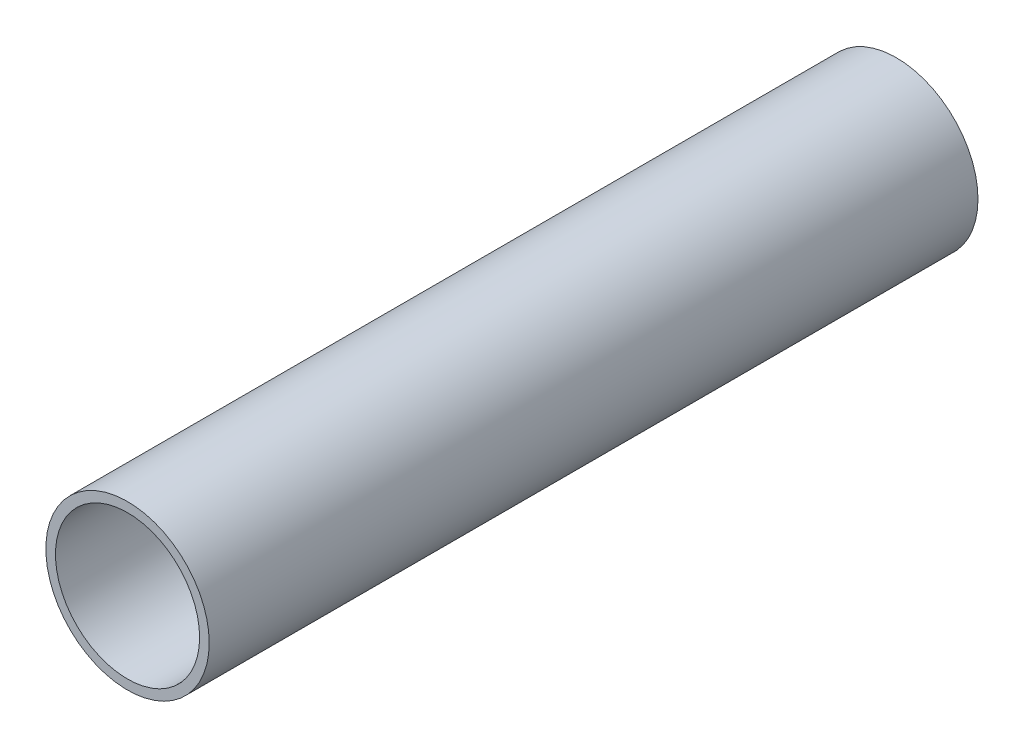
ISO-10303-21;
HEADER;
FILE_DESCRIPTION(('STEP AP214'),'2;1');
FILE_NAME('part.step','',(''),(''),'','','');
FILE_SCHEMA(('AUTOMOTIVE_DESIGN { 1 0 10303 214 1 1 1 1 }'));
ENDSEC;
DATA;
#1=APPLICATION_CONTEXT('core data for automotive mechanical design processes');
#2=APPLICATION_PROTOCOL_DEFINITION('international standard','automotive_design',2000,#1);
#3=PRODUCT_CONTEXT('',#1,'mechanical');
#4=PRODUCT('Part','Part','',(#3));
#5=PRODUCT_RELATED_PRODUCT_CATEGORY('part','',(#4));
#6=PRODUCT_DEFINITION_FORMATION('','',#4);
#7=PRODUCT_DEFINITION_CONTEXT('part definition',#1,'design');
#8=PRODUCT_DEFINITION('design','',#6,#7);
#9=PRODUCT_DEFINITION_SHAPE('','',#8);
#10=(LENGTH_UNIT() NAMED_UNIT(*) SI_UNIT(.MILLI.,.METRE.));
#11=(NAMED_UNIT(*) PLANE_ANGLE_UNIT() SI_UNIT($,.RADIAN.));
#12=(NAMED_UNIT(*) SI_UNIT($,.STERADIAN.) SOLID_ANGLE_UNIT());
#13=UNCERTAINTY_MEASURE_WITH_UNIT(LENGTH_MEASURE(1.E-05),#10,'distance_accuracy_value','');
#14=(GEOMETRIC_REPRESENTATION_CONTEXT(3) GLOBAL_UNCERTAINTY_ASSIGNED_CONTEXT((#13)) GLOBAL_UNIT_ASSIGNED_CONTEXT((#10,
#11,#12)) REPRESENTATION_CONTEXT('',''));
#15=CARTESIAN_POINT('',(0.,0.,0.));
#16=DIRECTION('',(0.,0.,1.));
#17=DIRECTION('',(1.,0.,0.));
#18=AXIS2_PLACEMENT_3D('',#15,#16,#17);
#19=CARTESIAN_POINT('',(0.,0.,400.));
#20=DIRECTION('',(0.,0.,1.));
#21=DIRECTION('',(1.,0.,0.));
#22=AXIS2_PLACEMENT_3D('',#19,#20,#21);
#23=PLANE('',#22);
#24=CARTESIAN_POINT('',(0.,0.,400.));
#25=DIRECTION('',(0.,0.,1.));
#26=DIRECTION('',(1.,0.,0.));
#27=AXIS2_PLACEMENT_3D('',#24,#25,#26);
#28=CIRCLE('',#27,42.5);
#29=CARTESIAN_POINT('',(42.5,0.,400.));
#30=VERTEX_POINT('',#29);
#31=EDGE_CURVE('E10',#30,#30,#28,.T.);
#32=ORIENTED_EDGE('',*,*,#31,.T.);
#33=EDGE_LOOP('',(#32));
#34=FACE_BOUND('',#33,.T.);
#35=CARTESIAN_POINT('',(0.,0.,400.));
#36=DIRECTION('',(0.,0.,1.));
#37=DIRECTION('',(1.,0.,0.));
#38=AXIS2_PLACEMENT_3D('',#35,#36,#37);
#39=CIRCLE('',#38,37.5);
#40=CARTESIAN_POINT('',(37.5,0.,400.));
#41=VERTEX_POINT('',#40);
#42=EDGE_CURVE('E49',#41,#41,#39,.T.);
#43=ORIENTED_EDGE('',*,*,#42,.F.);
#44=EDGE_LOOP('',(#43));
#45=FACE_BOUND('',#44,.T.);
#46=ADVANCED_FACE('F38',(#34,#45),#23,.T.);
#47=CARTESIAN_POINT('',(0.,0.,0.));
#48=DIRECTION('',(0.,0.,1.));
#49=DIRECTION('',(1.,0.,0.));
#50=AXIS2_PLACEMENT_3D('',#47,#48,#49);
#51=PLANE('',#50);
#52=CARTESIAN_POINT('',(0.,0.,0.));
#53=DIRECTION('',(0.,0.,1.));
#54=DIRECTION('',(1.,0.,0.));
#55=AXIS2_PLACEMENT_3D('',#52,#53,#54);
#56=CIRCLE('',#55,42.5);
#57=CARTESIAN_POINT('',(42.5,0.,0.));
#58=VERTEX_POINT('',#57);
#59=EDGE_CURVE('E42',#58,#58,#56,.T.);
#60=ORIENTED_EDGE('',*,*,#59,.F.);
#61=EDGE_LOOP('',(#60));
#62=FACE_BOUND('',#61,.T.);
#63=CARTESIAN_POINT('',(0.,0.,0.));
#64=DIRECTION('',(0.,0.,1.));
#65=DIRECTION('',(1.,0.,0.));
#66=AXIS2_PLACEMENT_3D('',#63,#64,#65);
#67=CIRCLE('',#66,37.5);
#68=CARTESIAN_POINT('',(37.5,0.,0.));
#69=VERTEX_POINT('',#68);
#70=EDGE_CURVE('E51',#69,#69,#67,.T.);
#71=ORIENTED_EDGE('',*,*,#70,.T.);
#72=EDGE_LOOP('',(#71));
#73=FACE_BOUND('',#72,.T.);
#74=ADVANCED_FACE('F61',(#62,#73),#51,.F.);
#75=CARTESIAN_POINT('',(0.,0.,400.));
#76=DIRECTION('',(0.,0.,-1.));
#77=DIRECTION('',(-1.,0.,0.));
#78=AXIS2_PLACEMENT_3D('',#75,#76,#77);
#79=CYLINDRICAL_SURFACE('',#78,42.5);
#80=ORIENTED_EDGE('',*,*,#31,.F.);
#81=EDGE_LOOP('',(#80));
#82=FACE_BOUND('',#81,.T.);
#83=ORIENTED_EDGE('',*,*,#59,.T.);
#84=EDGE_LOOP('',(#83));
#85=FACE_BOUND('',#84,.T.);
#86=ADVANCED_FACE('F40',(#82,#85),#79,.T.);
#87=CARTESIAN_POINT('',(0.,0.,400.));
#88=DIRECTION('',(0.,0.,-1.));
#89=DIRECTION('',(-1.,0.,0.));
#90=AXIS2_PLACEMENT_3D('',#87,#88,#89);
#91=CYLINDRICAL_SURFACE('',#90,37.5);
#92=ORIENTED_EDGE('',*,*,#42,.T.);
#93=EDGE_LOOP('',(#92));
#94=FACE_BOUND('',#93,.T.);
#95=ORIENTED_EDGE('',*,*,#70,.F.);
#96=EDGE_LOOP('',(#95));
#97=FACE_BOUND('',#96,.T.);
#98=ADVANCED_FACE('F57',(#94,#97),#91,.F.);
#99=CLOSED_SHELL('',(#46,#74,#86,#98));
#100=MANIFOLD_SOLID_BREP('B2',#99);
#101=ADVANCED_BREP_SHAPE_REPRESENTATION('',(#18,#100),#14);
#102=SHAPE_DEFINITION_REPRESENTATION(#9,#101);
ENDSEC;
END-ISO-10303-21;
